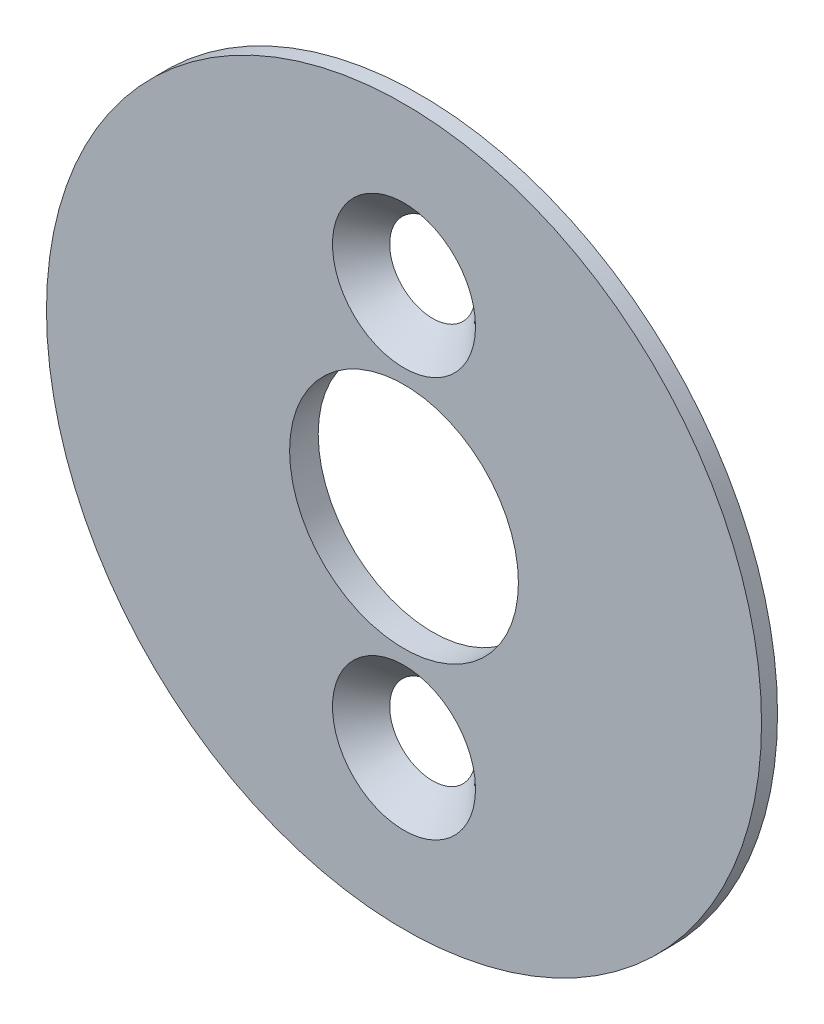
ISO-10303-21;
HEADER;
FILE_DESCRIPTION(('STEP AP214'),'2;1');
FILE_NAME('part.step','',(''),(''),'','','');
FILE_SCHEMA(('AUTOMOTIVE_DESIGN { 1 0 10303 214 1 1 1 1 }'));
ENDSEC;
DATA;
#1=APPLICATION_CONTEXT('core data for automotive mechanical design processes');
#2=APPLICATION_PROTOCOL_DEFINITION('international standard','automotive_design',2000,#1);
#3=PRODUCT_CONTEXT('',#1,'mechanical');
#4=PRODUCT('Part','Part','',(#3));
#5=PRODUCT_RELATED_PRODUCT_CATEGORY('part','',(#4));
#6=PRODUCT_DEFINITION_FORMATION('','',#4);
#7=PRODUCT_DEFINITION_CONTEXT('part definition',#1,'design');
#8=PRODUCT_DEFINITION('design','',#6,#7);
#9=PRODUCT_DEFINITION_SHAPE('','',#8);
#10=(LENGTH_UNIT() NAMED_UNIT(*) SI_UNIT(.MILLI.,.METRE.));
#11=(NAMED_UNIT(*) PLANE_ANGLE_UNIT() SI_UNIT($,.RADIAN.));
#12=(NAMED_UNIT(*) SI_UNIT($,.STERADIAN.) SOLID_ANGLE_UNIT());
#13=UNCERTAINTY_MEASURE_WITH_UNIT(LENGTH_MEASURE(1.E-05),#10,'distance_accuracy_value','');
#14=(GEOMETRIC_REPRESENTATION_CONTEXT(3) GLOBAL_UNCERTAINTY_ASSIGNED_CONTEXT((#13)) GLOBAL_UNIT_ASSIGNED_CONTEXT((#10,
#11,#12)) REPRESENTATION_CONTEXT('',''));
#15=CARTESIAN_POINT('',(0.,0.,0.));
#16=DIRECTION('',(0.,0.,1.));
#17=DIRECTION('',(1.,0.,0.));
#18=AXIS2_PLACEMENT_3D('',#15,#16,#17);
#19=CARTESIAN_POINT('',(0.,0.,1.));
#20=DIRECTION('',(0.,0.,-1.));
#21=DIRECTION('',(-1.,0.,0.));
#22=AXIS2_PLACEMENT_3D('',#19,#20,#21);
#23=CYLINDRICAL_SURFACE('',#22,12.5);
#24=CARTESIAN_POINT('',(0.,0.,1.));
#25=DIRECTION('',(0.,0.,1.));
#26=DIRECTION('',(1.,0.,0.));
#27=AXIS2_PLACEMENT_3D('',#24,#25,#26);
#28=CIRCLE('',#27,12.5);
#29=CARTESIAN_POINT('',(12.5,0.,1.));
#30=VERTEX_POINT('',#29);
#31=EDGE_CURVE('E10',#30,#30,#28,.T.);
#32=ORIENTED_EDGE('',*,*,#31,.F.);
#33=EDGE_LOOP('',(#32));
#34=FACE_BOUND('',#33,.T.);
#35=CARTESIAN_POINT('',(0.,0.,0.440817451771155));
#36=DIRECTION('',(0.,0.,1.));
#37=DIRECTION('',(1.,0.,0.));
#38=AXIS2_PLACEMENT_3D('',#35,#36,#37);
#39=CIRCLE('',#38,12.5);
#40=CARTESIAN_POINT('',(12.5,0.,0.440817451771155));
#41=VERTEX_POINT('',#40);
#42=EDGE_CURVE('E45',#41,#41,#39,.F.);
#43=ORIENTED_EDGE('',*,*,#42,.F.);
#44=EDGE_LOOP('',(#43));
#45=FACE_BOUND('',#44,.T.);
#46=ADVANCED_FACE('F39',(#34,#45),#23,.T.);
#47=CARTESIAN_POINT('',(0.,0.,1.));
#48=DIRECTION('',(0.,0.,1.));
#49=DIRECTION('',(1.,0.,0.));
#50=AXIS2_PLACEMENT_3D('',#47,#48,#49);
#51=PLANE('',#50);
#52=CARTESIAN_POINT('',(0.,7.,1.));
#53=DIRECTION('',(0.,0.,1.));
#54=DIRECTION('',(1.,0.,0.));
#55=AXIS2_PLACEMENT_3D('',#52,#53,#54);
#56=CIRCLE('',#55,2.5);
#57=CARTESIAN_POINT('',(2.5,7.,1.));
#58=VERTEX_POINT('',#57);
#59=EDGE_CURVE('E70',#58,#58,#56,.T.);
#60=ORIENTED_EDGE('',*,*,#59,.F.);
#61=EDGE_LOOP('',(#60));
#62=FACE_BOUND('',#61,.T.);
#63=CARTESIAN_POINT('',(0.,-7.,1.));
#64=DIRECTION('',(0.,0.,1.));
#65=DIRECTION('',(1.,0.,0.));
#66=AXIS2_PLACEMENT_3D('',#63,#64,#65);
#67=CIRCLE('',#66,2.5);
#68=CARTESIAN_POINT('',(2.5,-7.,1.));
#69=VERTEX_POINT('',#68);
#70=EDGE_CURVE('E64',#69,#69,#67,.T.);
#71=ORIENTED_EDGE('',*,*,#70,.F.);
#72=EDGE_LOOP('',(#71));
#73=FACE_BOUND('',#72,.T.);
#74=CARTESIAN_POINT('',(0.,0.,1.));
#75=DIRECTION('',(0.,0.,1.));
#76=DIRECTION('',(1.,0.,0.));
#77=AXIS2_PLACEMENT_3D('',#74,#75,#76);
#78=CIRCLE('',#77,4.);
#79=CARTESIAN_POINT('',(4.,0.,1.));
#80=VERTEX_POINT('',#79);
#81=EDGE_CURVE('E56',#80,#80,#78,.F.);
#82=ORIENTED_EDGE('',*,*,#81,.T.);
#83=EDGE_LOOP('',(#82));
#84=FACE_BOUND('',#83,.T.);
#85=ORIENTED_EDGE('',*,*,#31,.T.);
#86=EDGE_LOOP('',(#85));
#87=FACE_BOUND('',#86,.T.);
#88=ADVANCED_FACE('F76',(#62,#73,#84,#87),#51,.T.);
#89=CARTESIAN_POINT('',(0.,0.,0.));
#90=DIRECTION('',(0.,0.,1.));
#91=DIRECTION('',(1.,0.,0.));
#92=AXIS2_PLACEMENT_3D('',#89,#90,#91);
#93=CONICAL_SURFACE('',#92,10.,1.39626340159547);
#94=CARTESIAN_POINT('',(0.,0.,0.));
#95=DIRECTION('',(0.,0.,-1.));
#96=DIRECTION('',(-1.,0.,0.));
#97=AXIS2_PLACEMENT_3D('',#94,#95,#96);
#98=CIRCLE('',#97,10.);
#99=CARTESIAN_POINT('',(-10.,0.,0.));
#100=VERTEX_POINT('',#99);
#101=EDGE_CURVE('E49',#100,#100,#98,.T.);
#102=ORIENTED_EDGE('',*,*,#101,.F.);
#103=EDGE_LOOP('',(#102));
#104=FACE_BOUND('',#103,.T.);
#105=ORIENTED_EDGE('',*,*,#42,.T.);
#106=EDGE_LOOP('',(#105));
#107=FACE_BOUND('',#106,.T.);
#108=ADVANCED_FACE('F79',(#104,#107),#93,.T.);
#109=CARTESIAN_POINT('',(0.,0.,0.));
#110=DIRECTION('',(0.,0.,1.));
#111=DIRECTION('',(1.,0.,0.));
#112=AXIS2_PLACEMENT_3D('',#109,#110,#111);
#113=PLANE('',#112);
#114=CARTESIAN_POINT('',(0.,7.,0.));
#115=DIRECTION('',(0.,0.,1.));
#116=DIRECTION('',(1.,0.,0.));
#117=AXIS2_PLACEMENT_3D('',#114,#115,#116);
#118=CIRCLE('',#117,1.5);
#119=CARTESIAN_POINT('',(1.5,7.,0.));
#120=VERTEX_POINT('',#119);
#121=EDGE_CURVE('E67',#120,#120,#118,.T.);
#122=ORIENTED_EDGE('',*,*,#121,.T.);
#123=EDGE_LOOP('',(#122));
#124=FACE_BOUND('',#123,.T.);
#125=CARTESIAN_POINT('',(0.,-7.,0.));
#126=DIRECTION('',(0.,0.,1.));
#127=DIRECTION('',(1.,0.,0.));
#128=AXIS2_PLACEMENT_3D('',#125,#126,#127);
#129=CIRCLE('',#128,1.5);
#130=CARTESIAN_POINT('',(1.5,-7.,0.));
#131=VERTEX_POINT('',#130);
#132=EDGE_CURVE('E59',#131,#131,#129,.T.);
#133=ORIENTED_EDGE('',*,*,#132,.T.);
#134=EDGE_LOOP('',(#133));
#135=FACE_BOUND('',#134,.T.);
#136=CARTESIAN_POINT('',(0.,0.,0.));
#137=DIRECTION('',(0.,0.,-1.));
#138=DIRECTION('',(-1.,0.,0.));
#139=AXIS2_PLACEMENT_3D('',#136,#137,#138);
#140=CIRCLE('',#139,4.);
#141=CARTESIAN_POINT('',(-4.,0.,0.));
#142=VERTEX_POINT('',#141);
#143=EDGE_CURVE('E53',#142,#142,#140,.T.);
#144=ORIENTED_EDGE('',*,*,#143,.F.);
#145=EDGE_LOOP('',(#144));
#146=FACE_BOUND('',#145,.T.);
#147=ORIENTED_EDGE('',*,*,#101,.T.);
#148=EDGE_LOOP('',(#147));
#149=FACE_BOUND('',#148,.T.);
#150=ADVANCED_FACE('F89',(#124,#135,#146,#149),#113,.F.);
#151=CARTESIAN_POINT('',(0.,0.,1.001));
#152=DIRECTION('',(0.,0.,-1.));
#153=DIRECTION('',(-1.,0.,0.));
#154=AXIS2_PLACEMENT_3D('',#151,#152,#153);
#155=CYLINDRICAL_SURFACE('',#154,4.);
#156=ORIENTED_EDGE('',*,*,#81,.F.);
#157=EDGE_LOOP('',(#156));
#158=FACE_BOUND('',#157,.T.);
#159=ORIENTED_EDGE('',*,*,#143,.T.);
#160=EDGE_LOOP('',(#159));
#161=FACE_BOUND('',#160,.T.);
#162=ADVANCED_FACE('F85',(#158,#161),#155,.F.);
#163=CARTESIAN_POINT('',(0.,-7.,1.));
#164=DIRECTION('',(0.,0.,1.));
#165=DIRECTION('',(1.,0.,0.));
#166=AXIS2_PLACEMENT_3D('',#163,#164,#165);
#167=CONICAL_SURFACE('',#166,2.5,0.785398163397448);
#168=ORIENTED_EDGE('',*,*,#132,.F.);
#169=EDGE_LOOP('',(#168));
#170=FACE_BOUND('',#169,.T.);
#171=ORIENTED_EDGE('',*,*,#70,.T.);
#172=EDGE_LOOP('',(#171));
#173=FACE_BOUND('',#172,.T.);
#174=ADVANCED_FACE('F88',(#170,#173),#167,.F.);
#175=CARTESIAN_POINT('',(0.,7.,1.));
#176=DIRECTION('',(0.,0.,1.));
#177=DIRECTION('',(1.,0.,0.));
#178=AXIS2_PLACEMENT_3D('',#175,#176,#177);
#179=CONICAL_SURFACE('',#178,2.5,0.785398163397448);
#180=ORIENTED_EDGE('',*,*,#121,.F.);
#181=EDGE_LOOP('',(#180));
#182=FACE_BOUND('',#181,.T.);
#183=ORIENTED_EDGE('',*,*,#59,.T.);
#184=EDGE_LOOP('',(#183));
#185=FACE_BOUND('',#184,.T.);
#186=ADVANCED_FACE('F74',(#182,#185),#179,.F.);
#187=CLOSED_SHELL('',(#46,#88,#108,#150,#162,#174,#186));
#188=MANIFOLD_SOLID_BREP('B2',#187);
#189=ADVANCED_BREP_SHAPE_REPRESENTATION('',(#18,#188),#14);
#190=SHAPE_DEFINITION_REPRESENTATION(#9,#189);
ENDSEC;
END-ISO-10303-21;
